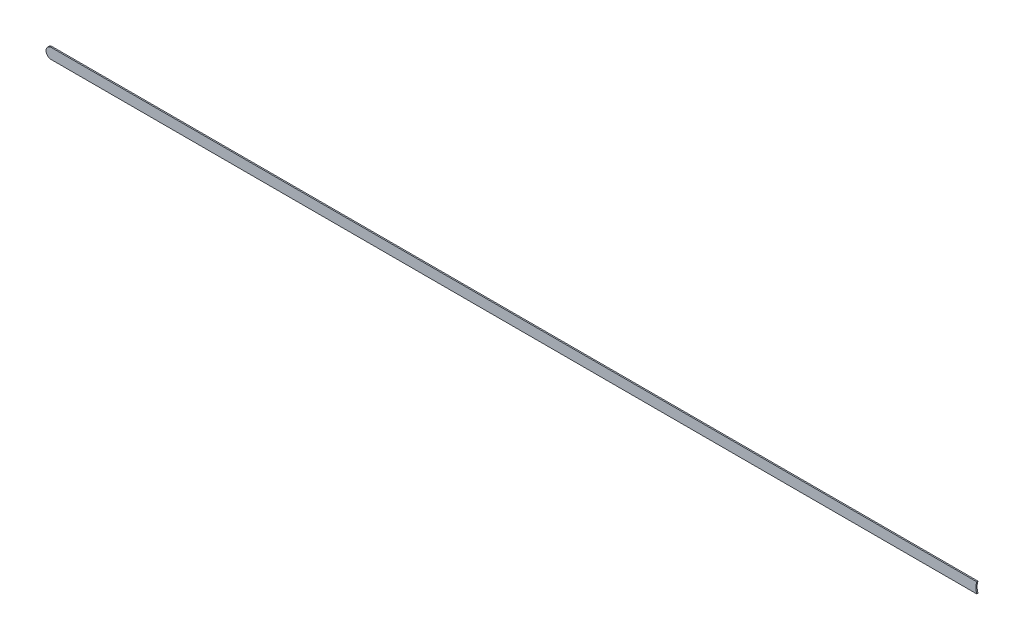
ISO-10303-21;
HEADER;
FILE_DESCRIPTION(('STEP AP214'),'2;1');
FILE_NAME('part.step','',(''),(''),'','','');
FILE_SCHEMA(('AUTOMOTIVE_DESIGN { 1 0 10303 214 1 1 1 1 }'));
ENDSEC;
DATA;
#1=APPLICATION_CONTEXT('core data for automotive mechanical design processes');
#2=APPLICATION_PROTOCOL_DEFINITION('international standard','automotive_design',2000,#1);
#3=PRODUCT_CONTEXT('',#1,'mechanical');
#4=PRODUCT('Part','Part','',(#3));
#5=PRODUCT_RELATED_PRODUCT_CATEGORY('part','',(#4));
#6=PRODUCT_DEFINITION_FORMATION('','',#4);
#7=PRODUCT_DEFINITION_CONTEXT('part definition',#1,'design');
#8=PRODUCT_DEFINITION('design','',#6,#7);
#9=PRODUCT_DEFINITION_SHAPE('','',#8);
#10=(LENGTH_UNIT() NAMED_UNIT(*) SI_UNIT(.MILLI.,.METRE.));
#11=(NAMED_UNIT(*) PLANE_ANGLE_UNIT() SI_UNIT($,.RADIAN.));
#12=(NAMED_UNIT(*) SI_UNIT($,.STERADIAN.) SOLID_ANGLE_UNIT());
#13=UNCERTAINTY_MEASURE_WITH_UNIT(LENGTH_MEASURE(1.E-05),#10,'distance_accuracy_value','');
#14=(GEOMETRIC_REPRESENTATION_CONTEXT(3) GLOBAL_UNCERTAINTY_ASSIGNED_CONTEXT((#13)) GLOBAL_UNIT_ASSIGNED_CONTEXT((#10,
#11,#12)) REPRESENTATION_CONTEXT('',''));
#15=CARTESIAN_POINT('',(0.,0.,0.));
#16=DIRECTION('',(0.,0.,1.));
#17=DIRECTION('',(1.,0.,0.));
#18=AXIS2_PLACEMENT_3D('',#15,#16,#17);
#19=CARTESIAN_POINT('',(164.,-88.86,1.6));
#20=DIRECTION('',(0.,-1.,0.));
#21=DIRECTION('',(0.,0.,-1.));
#22=AXIS2_PLACEMENT_3D('',#19,#20,#21);
#23=PLANE('',#22);
#24=DIRECTION('',(0.,0.,1.));
#25=VECTOR('',#24,1.);
#26=CARTESIAN_POINT('',(137.17,-88.86,1.6));
#27=LINE('',#26,#25);
#28=CARTESIAN_POINT('',(137.17,-88.86,1.6));
#29=VERTEX_POINT('',#28);
#30=CARTESIAN_POINT('',(137.17,-88.86,1.635));
#31=VERTEX_POINT('',#30);
#32=EDGE_CURVE('E11',#29,#31,#27,.T.);
#33=ORIENTED_EDGE('',*,*,#32,.T.);
#34=DIRECTION('',(-1.,0.,0.));
#35=VECTOR('',#34,1.);
#36=CARTESIAN_POINT('',(164.,-88.86,1.635));
#37=LINE('',#36,#35);
#38=CARTESIAN_POINT('',(163.54930609056,-88.86,1.635));
#39=VERTEX_POINT('',#38);
#40=EDGE_CURVE('E20',#39,#31,#37,.T.);
#41=ORIENTED_EDGE('',*,*,#40,.F.);
#42=DIRECTION('',(0.,0.,-1.));
#43=VECTOR('',#42,1.);
#44=CARTESIAN_POINT('',(163.54930609056,-88.86,-0.045));
#45=LINE('',#44,#43);
#46=CARTESIAN_POINT('',(163.54930609056,-88.86,1.6));
#47=VERTEX_POINT('',#46);
#48=EDGE_CURVE('E74',#39,#47,#45,.T.);
#49=ORIENTED_EDGE('',*,*,#48,.T.);
#50=DIRECTION('',(-1.,0.,0.));
#51=VECTOR('',#50,1.);
#52=CARTESIAN_POINT('',(164.,-88.86,1.6));
#53=LINE('',#52,#51);
#54=EDGE_CURVE('E107',#47,#29,#53,.T.);
#55=ORIENTED_EDGE('',*,*,#54,.T.);
#56=EDGE_LOOP('',(#33,#41,#49,#55));
#57=FACE_BOUND('',#56,.T.);
#58=ADVANCED_FACE('F17',(#57),#23,.F.);
#59=CARTESIAN_POINT('',(137.17,-89.01,1.6));
#60=DIRECTION('',(0.,0.,-1.));
#61=DIRECTION('',(-1.894780628694E-13,1.,0.));
#62=AXIS2_PLACEMENT_3D('',#59,#60,#61);
#63=CYLINDRICAL_SURFACE('',#62,0.15);
#64=CARTESIAN_POINT('',(137.17,-89.01,1.6));
#65=DIRECTION('',(0.,0.,1.));
#66=DIRECTION('',(-1.894780628694E-13,1.,0.));
#67=AXIS2_PLACEMENT_3D('',#64,#65,#66);
#68=CIRCLE('',#67,0.15);
#69=CARTESIAN_POINT('',(137.17,-89.16,1.6));
#70=VERTEX_POINT('',#69);
#71=EDGE_CURVE('E77',#29,#70,#68,.T.);
#72=ORIENTED_EDGE('',*,*,#71,.T.);
#73=DIRECTION('',(0.,0.,1.));
#74=VECTOR('',#73,1.);
#75=CARTESIAN_POINT('',(137.17,-89.16,1.6));
#76=LINE('',#75,#74);
#77=CARTESIAN_POINT('',(137.17,-89.16,1.635));
#78=VERTEX_POINT('',#77);
#79=EDGE_CURVE('E88',#70,#78,#76,.T.);
#80=ORIENTED_EDGE('',*,*,#79,.T.);
#81=CARTESIAN_POINT('',(137.17,-89.01,1.635));
#82=DIRECTION('',(0.,0.,1.));
#83=DIRECTION('',(-1.894780628694E-13,1.,0.));
#84=AXIS2_PLACEMENT_3D('',#81,#82,#83);
#85=CIRCLE('',#84,0.15);
#86=EDGE_CURVE('E83',#31,#78,#85,.T.);
#87=ORIENTED_EDGE('',*,*,#86,.F.);
#88=ORIENTED_EDGE('',*,*,#32,.F.);
#89=EDGE_LOOP('',(#72,#80,#87,#88));
#90=FACE_BOUND('',#89,.T.);
#91=ADVANCED_FACE('F121',(#90),#63,.T.);
#92=CARTESIAN_POINT('',(137.17,-89.16,1.635));
#93=DIRECTION('',(0.,0.,1.));
#94=DIRECTION('',(1.,0.,0.));
#95=AXIS2_PLACEMENT_3D('',#92,#93,#94);
#96=PLANE('',#95);
#97=ORIENTED_EDGE('',*,*,#86,.T.);
#98=DIRECTION('',(1.,0.,0.));
#99=VECTOR('',#98,1.);
#100=CARTESIAN_POINT('',(137.17,-89.16,1.635));
#101=LINE('',#100,#99);
#102=CARTESIAN_POINT('',(163.54930609055,-89.16,1.635));
#103=VERTEX_POINT('',#102);
#104=EDGE_CURVE('E80',#78,#103,#101,.T.);
#105=ORIENTED_EDGE('',*,*,#104,.T.);
#106=CARTESIAN_POINT('',(164.,-89.01,1.635));
#107=DIRECTION('',(0.,0.,-1.));
#108=DIRECTION('',(0.,-1.,0.));
#109=AXIS2_PLACEMENT_3D('',#106,#107,#108);
#110=CIRCLE('',#109,0.475);
#111=EDGE_CURVE('E68',#103,#39,#110,.T.);
#112=ORIENTED_EDGE('',*,*,#111,.T.);
#113=ORIENTED_EDGE('',*,*,#40,.T.);
#114=EDGE_LOOP('',(#97,#105,#112,#113));
#115=FACE_BOUND('',#114,.T.);
#116=ADVANCED_FACE('F81',(#115),#96,.T.);
#117=CARTESIAN_POINT('',(164.,-89.01,-0.045));
#118=DIRECTION('',(0.,0.,-1.));
#119=DIRECTION('',(0.,-1.,0.));
#120=AXIS2_PLACEMENT_3D('',#117,#118,#119);
#121=CYLINDRICAL_SURFACE('',#120,0.475);
#122=ORIENTED_EDGE('',*,*,#111,.F.);
#123=DIRECTION('',(0.,0.,-1.));
#124=VECTOR('',#123,1.);
#125=CARTESIAN_POINT('',(163.54930609056,-89.16,-0.045));
#126=LINE('',#125,#124);
#127=CARTESIAN_POINT('',(163.54930609055,-89.16,1.6));
#128=VERTEX_POINT('',#127);
#129=EDGE_CURVE('E73',#103,#128,#126,.T.);
#130=ORIENTED_EDGE('',*,*,#129,.T.);
#131=CARTESIAN_POINT('',(164.,-89.01,1.6));
#132=DIRECTION('',(0.,0.,-1.));
#133=DIRECTION('',(0.,-1.,0.));
#134=AXIS2_PLACEMENT_3D('',#131,#132,#133);
#135=CIRCLE('',#134,0.475);
#136=EDGE_CURVE('E102',#128,#47,#135,.T.);
#137=ORIENTED_EDGE('',*,*,#136,.T.);
#138=ORIENTED_EDGE('',*,*,#48,.F.);
#139=EDGE_LOOP('',(#122,#130,#137,#138));
#140=FACE_BOUND('',#139,.T.);
#141=ADVANCED_FACE('F70',(#140),#121,.F.);
#142=CARTESIAN_POINT('',(137.17,-89.16,1.6));
#143=DIRECTION('',(0.,0.,1.));
#144=DIRECTION('',(1.,0.,0.));
#145=AXIS2_PLACEMENT_3D('',#142,#143,#144);
#146=PLANE('',#145);
#147=ORIENTED_EDGE('',*,*,#54,.F.);
#148=ORIENTED_EDGE('',*,*,#136,.F.);
#149=DIRECTION('',(1.,0.,0.));
#150=VECTOR('',#149,1.);
#151=CARTESIAN_POINT('',(137.17,-89.16,1.6));
#152=LINE('',#151,#150);
#153=EDGE_CURVE('E93',#70,#128,#152,.T.);
#154=ORIENTED_EDGE('',*,*,#153,.F.);
#155=ORIENTED_EDGE('',*,*,#71,.F.);
#156=EDGE_LOOP('',(#147,#148,#154,#155));
#157=FACE_BOUND('',#156,.T.);
#158=ADVANCED_FACE('F119',(#157),#146,.F.);
#159=CARTESIAN_POINT('',(137.17,-89.16,1.6));
#160=DIRECTION('',(0.,1.,0.));
#161=DIRECTION('',(1.,0.,0.));
#162=AXIS2_PLACEMENT_3D('',#159,#160,#161);
#163=PLANE('',#162);
#164=ORIENTED_EDGE('',*,*,#129,.F.);
#165=ORIENTED_EDGE('',*,*,#104,.F.);
#166=ORIENTED_EDGE('',*,*,#79,.F.);
#167=ORIENTED_EDGE('',*,*,#153,.T.);
#168=EDGE_LOOP('',(#164,#165,#166,#167));
#169=FACE_BOUND('',#168,.T.);
#170=ADVANCED_FACE('F91',(#169),#163,.F.);
#171=CLOSED_SHELL('',(#58,#91,#116,#141,#158,#170));
#172=MANIFOLD_SOLID_BREP('B1',#171);
#173=ADVANCED_BREP_SHAPE_REPRESENTATION('',(#18,#172),#14);
#174=SHAPE_DEFINITION_REPRESENTATION(#9,#173);
ENDSEC;
END-ISO-10303-21;
